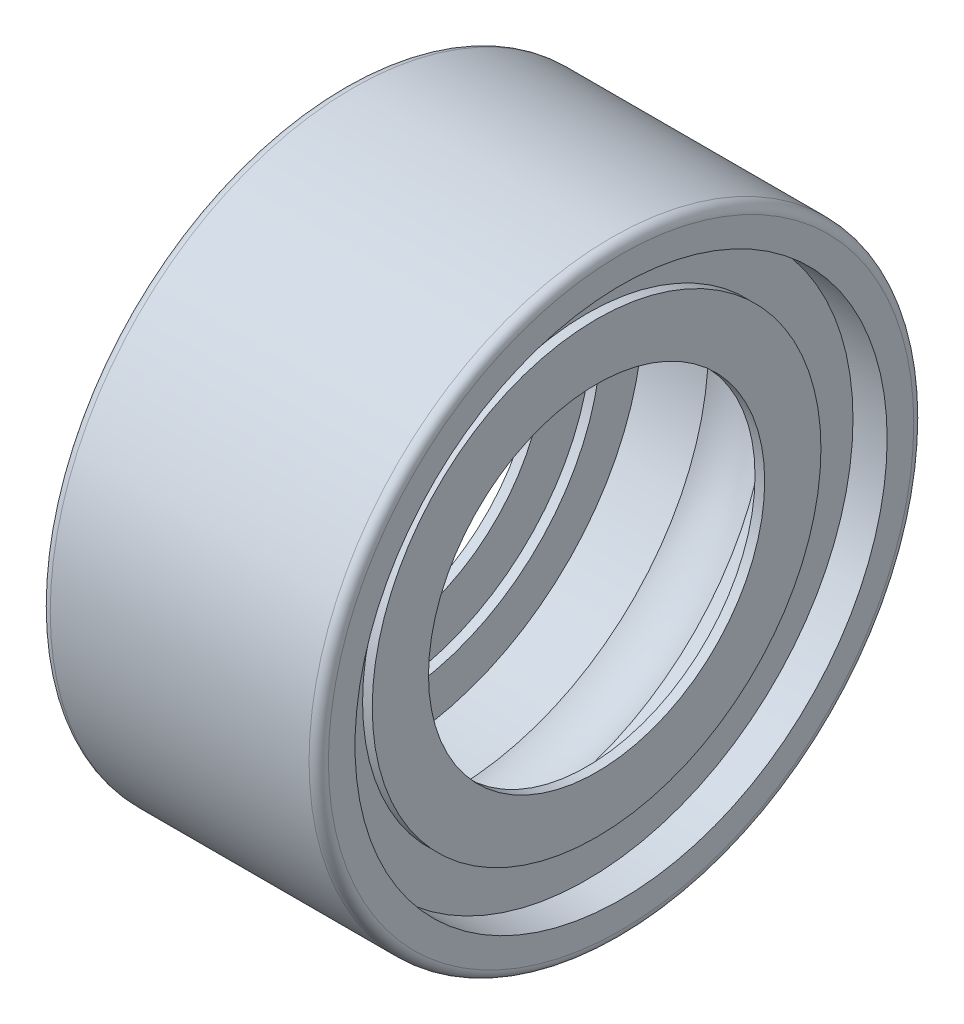
ISO-10303-21;
HEADER;
FILE_DESCRIPTION(('STEP AP214'),'2;1');
FILE_NAME('part.step','',(''),(''),'','','');
FILE_SCHEMA(('AUTOMOTIVE_DESIGN { 1 0 10303 214 1 1 1 1 }'));
ENDSEC;
DATA;
#1=APPLICATION_CONTEXT('core data for automotive mechanical design processes');
#2=APPLICATION_PROTOCOL_DEFINITION('international standard','automotive_design',2000,#1);
#3=PRODUCT_CONTEXT('',#1,'mechanical');
#4=PRODUCT('Part','Part','',(#3));
#5=PRODUCT_RELATED_PRODUCT_CATEGORY('part','',(#4));
#6=PRODUCT_DEFINITION_FORMATION('','',#4);
#7=PRODUCT_DEFINITION_CONTEXT('part definition',#1,'design');
#8=PRODUCT_DEFINITION('design','',#6,#7);
#9=PRODUCT_DEFINITION_SHAPE('','',#8);
#10=(LENGTH_UNIT() NAMED_UNIT(*) SI_UNIT(.MILLI.,.METRE.));
#11=(NAMED_UNIT(*) PLANE_ANGLE_UNIT() SI_UNIT($,.RADIAN.));
#12=(NAMED_UNIT(*) SI_UNIT($,.STERADIAN.) SOLID_ANGLE_UNIT());
#13=UNCERTAINTY_MEASURE_WITH_UNIT(LENGTH_MEASURE(1.E-05),#10,'distance_accuracy_value','');
#14=(GEOMETRIC_REPRESENTATION_CONTEXT(3) GLOBAL_UNCERTAINTY_ASSIGNED_CONTEXT((#13)) GLOBAL_UNIT_ASSIGNED_CONTEXT((#10,
#11,#12)) REPRESENTATION_CONTEXT('',''));
#15=CARTESIAN_POINT('',(0.,0.,0.));
#16=DIRECTION('',(0.,0.,1.));
#17=DIRECTION('',(1.,0.,0.));
#18=AXIS2_PLACEMENT_3D('',#15,#16,#17);
#19=CARTESIAN_POINT('',(-2.65,0.,0.));
#20=DIRECTION('',(1.,0.,0.));
#21=DIRECTION('',(0.,0.,1.));
#22=AXIS2_PLACEMENT_3D('',#19,#20,#21);
#23=TOROIDAL_SURFACE('',#22,1.775,0.425000000000002);
#24=CARTESIAN_POINT('',(-2.8981934729,0.,0.));
#25=DIRECTION('',(1.,0.,0.));
#26=DIRECTION('',(0.,0.,-1.));
#27=AXIS2_PLACEMENT_3D('',#24,#25,#26);
#28=CIRCLE('',#27,2.12);
#29=CARTESIAN_POINT('',(-2.8981934729,0.,-2.12));
#30=VERTEX_POINT('',#29);
#31=EDGE_CURVE('E466',#30,#30,#28,.F.);
#32=ORIENTED_EDGE('',*,*,#31,.T.);
#33=EDGE_LOOP('',(#32));
#34=FACE_BOUND('',#33,.T.);
#35=CARTESIAN_POINT('',(-2.40180652707996,0.,0.));
#36=DIRECTION('',(1.,0.,0.));
#37=DIRECTION('',(0.,0.,-1.));
#38=AXIS2_PLACEMENT_3D('',#35,#36,#37);
#39=CIRCLE('',#38,2.11999999999992);
#40=CARTESIAN_POINT('',(-2.40180652707996,0.,-2.11999999999992));
#41=VERTEX_POINT('',#40);
#42=EDGE_CURVE('E463',#41,#41,#39,.T.);
#43=ORIENTED_EDGE('',*,*,#42,.T.);
#44=EDGE_LOOP('',(#43));
#45=FACE_BOUND('',#44,.T.);
#46=ADVANCED_FACE('F17',(#34,#45),#23,.F.);
#47=CARTESIAN_POINT('',(-3.16784673645,0.,0.));
#48=DIRECTION('',(1.,0.,0.));
#49=DIRECTION('',(0.,0.,-1.));
#50=AXIS2_PLACEMENT_3D('',#47,#48,#49);
#51=CYLINDRICAL_SURFACE('',#50,2.12);
#52=CARTESIAN_POINT('',(-3.4375,0.,0.));
#53=DIRECTION('',(1.,0.,0.));
#54=DIRECTION('',(0.,0.,-1.));
#55=AXIS2_PLACEMENT_3D('',#52,#53,#54);
#56=CIRCLE('',#55,2.12);
#57=CARTESIAN_POINT('',(-3.4375,0.,-2.12));
#58=VERTEX_POINT('',#57);
#59=EDGE_CURVE('E461',#58,#58,#56,.T.);
#60=ORIENTED_EDGE('',*,*,#59,.F.);
#61=EDGE_LOOP('',(#60));
#62=FACE_BOUND('',#61,.T.);
#63=ORIENTED_EDGE('',*,*,#31,.F.);
#64=EDGE_LOOP('',(#63));
#65=FACE_BOUND('',#64,.T.);
#66=ADVANCED_FACE('F217',(#62,#65),#51,.F.);
#67=CARTESIAN_POINT('',(-2.13215326353998,0.,0.));
#68=DIRECTION('',(1.,0.,0.));
#69=DIRECTION('',(0.,0.,-1.));
#70=AXIS2_PLACEMENT_3D('',#67,#68,#69);
#71=CYLINDRICAL_SURFACE('',#70,2.11999999999992);
#72=ORIENTED_EDGE('',*,*,#42,.F.);
#73=EDGE_LOOP('',(#72));
#74=FACE_BOUND('',#73,.T.);
#75=CARTESIAN_POINT('',(-1.8625,0.,0.));
#76=DIRECTION('',(1.,0.,0.));
#77=DIRECTION('',(0.,0.,-1.));
#78=AXIS2_PLACEMENT_3D('',#75,#76,#77);
#79=CIRCLE('',#78,2.11999999999992);
#80=CARTESIAN_POINT('',(-1.8625,0.,-2.11999999999992));
#81=VERTEX_POINT('',#80);
#82=EDGE_CURVE('E459',#81,#81,#79,.F.);
#83=ORIENTED_EDGE('',*,*,#82,.F.);
#84=EDGE_LOOP('',(#83));
#85=FACE_BOUND('',#84,.T.);
#86=ADVANCED_FACE('F210',(#74,#85),#71,.F.);
#87=CARTESIAN_POINT('',(-3.4375,0.,1.9875));
#88=DIRECTION('',(1.,0.,0.));
#89=DIRECTION('',(0.,0.,-1.));
#90=AXIS2_PLACEMENT_3D('',#87,#88,#89);
#91=PLANE('',#90);
#92=ORIENTED_EDGE('',*,*,#59,.T.);
#93=EDGE_LOOP('',(#92));
#94=FACE_BOUND('',#93,.T.);
#95=CARTESIAN_POINT('',(-3.4375,0.,0.));
#96=DIRECTION('',(1.,0.,0.));
#97=DIRECTION('',(0.,0.,-1.));
#98=AXIS2_PLACEMENT_3D('',#95,#96,#97);
#99=CIRCLE('',#98,1.775);
#100=CARTESIAN_POINT('',(-3.4375,0.,-1.775));
#101=VERTEX_POINT('',#100);
#102=EDGE_CURVE('E456',#101,#101,#99,.F.);
#103=ORIENTED_EDGE('',*,*,#102,.T.);
#104=EDGE_LOOP('',(#103));
#105=FACE_BOUND('',#104,.T.);
#106=ADVANCED_FACE('F216',(#94,#105),#91,.T.);
#107=CARTESIAN_POINT('',(-1.8625,0.,1.9875));
#108=DIRECTION('',(-1.,0.,0.));
#109=DIRECTION('',(0.,0.,1.));
#110=AXIS2_PLACEMENT_3D('',#107,#108,#109);
#111=PLANE('',#110);
#112=ORIENTED_EDGE('',*,*,#82,.T.);
#113=EDGE_LOOP('',(#112));
#114=FACE_BOUND('',#113,.T.);
#115=CARTESIAN_POINT('',(-1.8625,0.,0.));
#116=DIRECTION('',(-1.,0.,0.));
#117=DIRECTION('',(0.,0.,1.));
#118=AXIS2_PLACEMENT_3D('',#115,#116,#117);
#119=CIRCLE('',#118,1.775);
#120=CARTESIAN_POINT('',(-1.8625,0.,1.775));
#121=VERTEX_POINT('',#120);
#122=EDGE_CURVE('E453',#121,#121,#119,.F.);
#123=ORIENTED_EDGE('',*,*,#122,.T.);
#124=EDGE_LOOP('',(#123));
#125=FACE_BOUND('',#124,.T.);
#126=ADVANCED_FACE('F273',(#114,#125),#111,.T.);
#127=CARTESIAN_POINT('',(-3.4775,0.,0.));
#128=DIRECTION('',(1.,0.,0.));
#129=DIRECTION('',(0.,0.,-1.));
#130=AXIS2_PLACEMENT_3D('',#127,#128,#129);
#131=CYLINDRICAL_SURFACE('',#130,1.775);
#132=CARTESIAN_POINT('',(-3.5175,0.,0.));
#133=DIRECTION('',(1.,0.,0.));
#134=DIRECTION('',(0.,0.,-1.));
#135=AXIS2_PLACEMENT_3D('',#132,#133,#134);
#136=CIRCLE('',#135,1.775);
#137=CARTESIAN_POINT('',(-3.5175,0.,-1.775));
#138=VERTEX_POINT('',#137);
#139=EDGE_CURVE('E450',#138,#138,#136,.T.);
#140=ORIENTED_EDGE('',*,*,#139,.F.);
#141=EDGE_LOOP('',(#140));
#142=FACE_BOUND('',#141,.T.);
#143=ORIENTED_EDGE('',*,*,#102,.F.);
#144=EDGE_LOOP('',(#143));
#145=FACE_BOUND('',#144,.T.);
#146=ADVANCED_FACE('F280',(#142,#145),#131,.F.);
#147=CARTESIAN_POINT('',(-1.8225,0.,0.));
#148=DIRECTION('',(-1.,0.,0.));
#149=DIRECTION('',(0.,0.,1.));
#150=AXIS2_PLACEMENT_3D('',#147,#148,#149);
#151=CYLINDRICAL_SURFACE('',#150,1.775);
#152=CARTESIAN_POINT('',(-1.7825,0.,0.));
#153=DIRECTION('',(-1.,0.,0.));
#154=DIRECTION('',(0.,0.,1.));
#155=AXIS2_PLACEMENT_3D('',#152,#153,#154);
#156=CIRCLE('',#155,1.775);
#157=CARTESIAN_POINT('',(-1.7825,0.,1.775));
#158=VERTEX_POINT('',#157);
#159=EDGE_CURVE('E447',#158,#158,#156,.T.);
#160=ORIENTED_EDGE('',*,*,#159,.F.);
#161=EDGE_LOOP('',(#160));
#162=FACE_BOUND('',#161,.T.);
#163=ORIENTED_EDGE('',*,*,#122,.F.);
#164=EDGE_LOOP('',(#163));
#165=FACE_BOUND('',#164,.T.);
#166=ADVANCED_FACE('F288',(#162,#165),#151,.F.);
#167=CARTESIAN_POINT('',(-3.5175,0.,1.5825));
#168=DIRECTION('',(1.,0.,0.));
#169=DIRECTION('',(0.,0.,-1.));
#170=AXIS2_PLACEMENT_3D('',#167,#168,#169);
#171=PLANE('',#170);
#172=ORIENTED_EDGE('',*,*,#139,.T.);
#173=EDGE_LOOP('',(#172));
#174=FACE_BOUND('',#173,.T.);
#175=CARTESIAN_POINT('',(-3.5175,0.,0.));
#176=DIRECTION('',(1.,0.,0.));
#177=DIRECTION('',(0.,0.,-1.));
#178=AXIS2_PLACEMENT_3D('',#175,#176,#177);
#179=CIRCLE('',#178,1.39);
#180=CARTESIAN_POINT('',(-3.5175,0.,-1.39));
#181=VERTEX_POINT('',#180);
#182=EDGE_CURVE('E444',#181,#181,#179,.F.);
#183=ORIENTED_EDGE('',*,*,#182,.T.);
#184=EDGE_LOOP('',(#183));
#185=FACE_BOUND('',#184,.T.);
#186=ADVANCED_FACE('F296',(#174,#185),#171,.T.);
#187=CARTESIAN_POINT('',(-1.7825,0.,1.5825));
#188=DIRECTION('',(-1.,0.,0.));
#189=DIRECTION('',(0.,0.,1.));
#190=AXIS2_PLACEMENT_3D('',#187,#188,#189);
#191=PLANE('',#190);
#192=ORIENTED_EDGE('',*,*,#159,.T.);
#193=EDGE_LOOP('',(#192));
#194=FACE_BOUND('',#193,.T.);
#195=CARTESIAN_POINT('',(-1.7825,0.,0.));
#196=DIRECTION('',(-1.,0.,0.));
#197=DIRECTION('',(0.,0.,1.));
#198=AXIS2_PLACEMENT_3D('',#195,#196,#197);
#199=CIRCLE('',#198,1.39);
#200=CARTESIAN_POINT('',(-1.7825,0.,1.39));
#201=VERTEX_POINT('',#200);
#202=EDGE_CURVE('E441',#201,#201,#199,.F.);
#203=ORIENTED_EDGE('',*,*,#202,.T.);
#204=EDGE_LOOP('',(#203));
#205=FACE_BOUND('',#204,.T.);
#206=ADVANCED_FACE('F304',(#194,#205),#191,.T.);
#207=CARTESIAN_POINT('',(-3.5575,0.,0.));
#208=DIRECTION('',(1.,0.,0.));
#209=DIRECTION('',(0.,0.,-1.));
#210=AXIS2_PLACEMENT_3D('',#207,#208,#209);
#211=CYLINDRICAL_SURFACE('',#210,1.39);
#212=CARTESIAN_POINT('',(-3.5975,0.,0.));
#213=DIRECTION('',(1.,0.,0.));
#214=DIRECTION('',(0.,0.,-1.));
#215=AXIS2_PLACEMENT_3D('',#212,#213,#214);
#216=CIRCLE('',#215,1.39);
#217=CARTESIAN_POINT('',(-3.5975,0.,-1.39));
#218=VERTEX_POINT('',#217);
#219=EDGE_CURVE('E438',#218,#218,#216,.T.);
#220=ORIENTED_EDGE('',*,*,#219,.F.);
#221=EDGE_LOOP('',(#220));
#222=FACE_BOUND('',#221,.T.);
#223=ORIENTED_EDGE('',*,*,#182,.F.);
#224=EDGE_LOOP('',(#223));
#225=FACE_BOUND('',#224,.T.);
#226=ADVANCED_FACE('F312',(#222,#225),#211,.F.);
#227=CARTESIAN_POINT('',(-1.7425,0.,0.));
#228=DIRECTION('',(-1.,0.,0.));
#229=DIRECTION('',(0.,0.,1.));
#230=AXIS2_PLACEMENT_3D('',#227,#228,#229);
#231=CYLINDRICAL_SURFACE('',#230,1.39);
#232=CARTESIAN_POINT('',(-1.7025,0.,0.));
#233=DIRECTION('',(-1.,0.,0.));
#234=DIRECTION('',(0.,0.,1.));
#235=AXIS2_PLACEMENT_3D('',#232,#233,#234);
#236=CIRCLE('',#235,1.39);
#237=CARTESIAN_POINT('',(-1.7025,0.,1.39));
#238=VERTEX_POINT('',#237);
#239=EDGE_CURVE('E435',#238,#238,#236,.T.);
#240=ORIENTED_EDGE('',*,*,#239,.F.);
#241=EDGE_LOOP('',(#240));
#242=FACE_BOUND('',#241,.T.);
#243=ORIENTED_EDGE('',*,*,#202,.F.);
#244=EDGE_LOOP('',(#243));
#245=FACE_BOUND('',#244,.T.);
#246=ADVANCED_FACE('F320',(#242,#245),#231,.F.);
#247=CARTESIAN_POINT('',(-3.5975,0.,1.6225));
#248=DIRECTION('',(-1.,0.,0.));
#249=DIRECTION('',(0.,0.,1.));
#250=AXIS2_PLACEMENT_3D('',#247,#248,#249);
#251=PLANE('',#250);
#252=ORIENTED_EDGE('',*,*,#219,.T.);
#253=EDGE_LOOP('',(#252));
#254=FACE_BOUND('',#253,.T.);
#255=CARTESIAN_POINT('',(-3.5975,0.,0.));
#256=DIRECTION('',(1.,0.,0.));
#257=DIRECTION('',(0.,0.,-1.));
#258=AXIS2_PLACEMENT_3D('',#255,#256,#257);
#259=CIRCLE('',#258,1.855);
#260=CARTESIAN_POINT('',(-3.5975,0.,-1.855));
#261=VERTEX_POINT('',#260);
#262=EDGE_CURVE('E432',#261,#261,#259,.T.);
#263=ORIENTED_EDGE('',*,*,#262,.F.);
#264=EDGE_LOOP('',(#263));
#265=FACE_BOUND('',#264,.T.);
#266=ADVANCED_FACE('F328',(#254,#265),#251,.T.);
#267=CARTESIAN_POINT('',(-1.7025,0.,1.6225));
#268=DIRECTION('',(1.,0.,0.));
#269=DIRECTION('',(0.,0.,-1.));
#270=AXIS2_PLACEMENT_3D('',#267,#268,#269);
#271=PLANE('',#270);
#272=ORIENTED_EDGE('',*,*,#239,.T.);
#273=EDGE_LOOP('',(#272));
#274=FACE_BOUND('',#273,.T.);
#275=CARTESIAN_POINT('',(-1.7025,0.,0.));
#276=DIRECTION('',(-1.,0.,0.));
#277=DIRECTION('',(0.,0.,1.));
#278=AXIS2_PLACEMENT_3D('',#275,#276,#277);
#279=CIRCLE('',#278,1.855);
#280=CARTESIAN_POINT('',(-1.7025,0.,1.855));
#281=VERTEX_POINT('',#280);
#282=EDGE_CURVE('E429',#281,#281,#279,.T.);
#283=ORIENTED_EDGE('',*,*,#282,.F.);
#284=EDGE_LOOP('',(#283));
#285=FACE_BOUND('',#284,.T.);
#286=ADVANCED_FACE('F336',(#274,#285),#271,.T.);
#287=CARTESIAN_POINT('',(-3.5575,0.,0.));
#288=DIRECTION('',(1.,0.,0.));
#289=DIRECTION('',(0.,0.,-1.));
#290=AXIS2_PLACEMENT_3D('',#287,#288,#289);
#291=CYLINDRICAL_SURFACE('',#290,1.855);
#292=CARTESIAN_POINT('',(-3.5175,0.,0.));
#293=DIRECTION('',(1.,0.,0.));
#294=DIRECTION('',(0.,0.,-1.));
#295=AXIS2_PLACEMENT_3D('',#292,#293,#294);
#296=CIRCLE('',#295,1.855);
#297=CARTESIAN_POINT('',(-3.5175,0.,-1.855));
#298=VERTEX_POINT('',#297);
#299=EDGE_CURVE('E426',#298,#298,#296,.T.);
#300=ORIENTED_EDGE('',*,*,#299,.F.);
#301=EDGE_LOOP('',(#300));
#302=FACE_BOUND('',#301,.T.);
#303=ORIENTED_EDGE('',*,*,#262,.T.);
#304=EDGE_LOOP('',(#303));
#305=FACE_BOUND('',#304,.T.);
#306=ADVANCED_FACE('F344',(#302,#305),#291,.T.);
#307=CARTESIAN_POINT('',(-1.7425,0.,0.));
#308=DIRECTION('',(-1.,0.,0.));
#309=DIRECTION('',(0.,0.,1.));
#310=AXIS2_PLACEMENT_3D('',#307,#308,#309);
#311=CYLINDRICAL_SURFACE('',#310,1.855);
#312=CARTESIAN_POINT('',(-1.7825,0.,0.));
#313=DIRECTION('',(-1.,0.,0.));
#314=DIRECTION('',(0.,0.,1.));
#315=AXIS2_PLACEMENT_3D('',#312,#313,#314);
#316=CIRCLE('',#315,1.855);
#317=CARTESIAN_POINT('',(-1.7825,0.,1.855));
#318=VERTEX_POINT('',#317);
#319=EDGE_CURVE('E413',#318,#318,#316,.T.);
#320=ORIENTED_EDGE('',*,*,#319,.F.);
#321=EDGE_LOOP('',(#320));
#322=FACE_BOUND('',#321,.T.);
#323=ORIENTED_EDGE('',*,*,#282,.T.);
#324=EDGE_LOOP('',(#323));
#325=FACE_BOUND('',#324,.T.);
#326=ADVANCED_FACE('F352',(#322,#325),#311,.T.);
#327=CARTESIAN_POINT('',(-3.5175,0.,2.0275));
#328=DIRECTION('',(-1.,0.,0.));
#329=DIRECTION('',(0.,0.,1.));
#330=AXIS2_PLACEMENT_3D('',#327,#328,#329);
#331=PLANE('',#330);
#332=ORIENTED_EDGE('',*,*,#299,.T.);
#333=EDGE_LOOP('',(#332));
#334=FACE_BOUND('',#333,.T.);
#335=CARTESIAN_POINT('',(-3.5175,0.,0.));
#336=DIRECTION('',(1.,0.,0.));
#337=DIRECTION('',(0.,0.,-1.));
#338=AXIS2_PLACEMENT_3D('',#335,#336,#337);
#339=CIRCLE('',#338,2.2);
#340=CARTESIAN_POINT('',(-3.5175,0.,-2.2));
#341=VERTEX_POINT('',#340);
#342=EDGE_CURVE('E417',#341,#341,#339,.F.);
#343=ORIENTED_EDGE('',*,*,#342,.T.);
#344=EDGE_LOOP('',(#343));
#345=FACE_BOUND('',#344,.T.);
#346=ADVANCED_FACE('F360',(#334,#345),#331,.T.);
#347=CARTESIAN_POINT('',(-1.7825,0.,2.0275));
#348=DIRECTION('',(1.,0.,0.));
#349=DIRECTION('',(0.,0.,-1.));
#350=AXIS2_PLACEMENT_3D('',#347,#348,#349);
#351=PLANE('',#350);
#352=ORIENTED_EDGE('',*,*,#319,.T.);
#353=EDGE_LOOP('',(#352));
#354=FACE_BOUND('',#353,.T.);
#355=CARTESIAN_POINT('',(-1.7825,0.,0.));
#356=DIRECTION('',(1.,0.,0.));
#357=DIRECTION('',(0.,0.,-1.));
#358=AXIS2_PLACEMENT_3D('',#355,#356,#357);
#359=CIRCLE('',#358,2.2);
#360=CARTESIAN_POINT('',(-1.7825,0.,-2.2));
#361=VERTEX_POINT('',#360);
#362=EDGE_CURVE('E416',#361,#361,#359,.T.);
#363=ORIENTED_EDGE('',*,*,#362,.T.);
#364=EDGE_LOOP('',(#363));
#365=FACE_BOUND('',#364,.T.);
#366=ADVANCED_FACE('F203',(#354,#365),#351,.T.);
#367=CARTESIAN_POINT('',(-3.61875,0.,0.));
#368=DIRECTION('',(1.,0.,0.));
#369=DIRECTION('',(0.,0.,-1.));
#370=AXIS2_PLACEMENT_3D('',#367,#368,#369);
#371=CYLINDRICAL_SURFACE('',#370,2.2);
#372=CARTESIAN_POINT('',(-3.8,0.,0.));
#373=DIRECTION('',(1.,0.,0.));
#374=DIRECTION('',(0.,0.,-1.));
#375=AXIS2_PLACEMENT_3D('',#372,#373,#374);
#376=CIRCLE('',#375,2.2);
#377=CARTESIAN_POINT('',(-3.8,0.,-2.2));
#378=VERTEX_POINT('',#377);
#379=EDGE_CURVE('E55',#378,#378,#376,.T.);
#380=ORIENTED_EDGE('',*,*,#379,.F.);
#381=EDGE_LOOP('',(#380));
#382=FACE_BOUND('',#381,.T.);
#383=ORIENTED_EDGE('',*,*,#342,.F.);
#384=EDGE_LOOP('',(#383));
#385=FACE_BOUND('',#384,.T.);
#386=ADVANCED_FACE('F193',(#382,#385),#371,.F.);
#387=CARTESIAN_POINT('',(-1.68125,0.,0.));
#388=DIRECTION('',(1.,0.,0.));
#389=DIRECTION('',(0.,0.,-1.));
#390=AXIS2_PLACEMENT_3D('',#387,#388,#389);
#391=CYLINDRICAL_SURFACE('',#390,2.2);
#392=ORIENTED_EDGE('',*,*,#362,.F.);
#393=EDGE_LOOP('',(#392));
#394=FACE_BOUND('',#393,.T.);
#395=CARTESIAN_POINT('',(-1.5,0.,0.));
#396=DIRECTION('',(1.,0.,0.));
#397=DIRECTION('',(0.,0.,-1.));
#398=AXIS2_PLACEMENT_3D('',#395,#396,#397);
#399=CIRCLE('',#398,2.2);
#400=CARTESIAN_POINT('',(-1.5,0.,-2.2));
#401=VERTEX_POINT('',#400);
#402=EDGE_CURVE('E54',#401,#401,#399,.F.);
#403=ORIENTED_EDGE('',*,*,#402,.F.);
#404=EDGE_LOOP('',(#403));
#405=FACE_BOUND('',#404,.T.);
#406=ADVANCED_FACE('F80',(#394,#405),#391,.F.);
#407=CARTESIAN_POINT('',(-3.8,0.,-2.31));
#408=DIRECTION('',(-1.,0.,0.));
#409=DIRECTION('',(0.,0.,1.));
#410=AXIS2_PLACEMENT_3D('',#407,#408,#409);
#411=PLANE('',#410);
#412=ORIENTED_EDGE('',*,*,#379,.T.);
#413=EDGE_LOOP('',(#412));
#414=FACE_BOUND('',#413,.T.);
#415=CARTESIAN_POINT('',(-3.8,0.,0.));
#416=DIRECTION('',(1.,0.,0.));
#417=DIRECTION('',(0.,0.,-1.));
#418=AXIS2_PLACEMENT_3D('',#415,#416,#417);
#419=CIRCLE('',#418,2.42);
#420=CARTESIAN_POINT('',(-3.8,0.,-2.42));
#421=VERTEX_POINT('',#420);
#422=CARTESIAN_POINT('',(-3.8,0.,2.42));
#423=VERTEX_POINT('',#422);
#424=EDGE_CURVE('E50',#421,#423,#419,.T.);
#425=ORIENTED_EDGE('',*,*,#424,.F.);
#426=CARTESIAN_POINT('',(-3.8,0.,0.));
#427=DIRECTION('',(1.,0.,0.));
#428=DIRECTION('',(0.,0.,1.));
#429=AXIS2_PLACEMENT_3D('',#426,#427,#428);
#430=CIRCLE('',#429,2.42);
#431=EDGE_CURVE('E46',#423,#421,#430,.T.);
#432=ORIENTED_EDGE('',*,*,#431,.F.);
#433=EDGE_LOOP('',(#425,#432));
#434=FACE_BOUND('',#433,.T.);
#435=ADVANCED_FACE('F59',(#414,#434),#411,.T.);
#436=CARTESIAN_POINT('',(-1.5,0.,-2.31));
#437=DIRECTION('',(1.,0.,0.));
#438=DIRECTION('',(0.,0.,-1.));
#439=AXIS2_PLACEMENT_3D('',#436,#437,#438);
#440=PLANE('',#439);
#441=CARTESIAN_POINT('',(-1.5,0.,0.));
#442=DIRECTION('',(-1.,0.,0.));
#443=DIRECTION('',(0.,0.,1.));
#444=AXIS2_PLACEMENT_3D('',#441,#442,#443);
#445=CIRCLE('',#444,2.42);
#446=CARTESIAN_POINT('',(-1.5,0.,2.42));
#447=VERTEX_POINT('',#446);
#448=CARTESIAN_POINT('',(-1.5,0.,-2.42));
#449=VERTEX_POINT('',#448);
#450=EDGE_CURVE('E60',#447,#449,#445,.T.);
#451=ORIENTED_EDGE('',*,*,#450,.F.);
#452=CARTESIAN_POINT('',(-1.5,0.,0.));
#453=DIRECTION('',(-1.,0.,0.));
#454=DIRECTION('',(0.,0.,-1.));
#455=AXIS2_PLACEMENT_3D('',#452,#453,#454);
#456=CIRCLE('',#455,2.42);
#457=EDGE_CURVE('E35',#447,#449,#456,.F.);
#458=ORIENTED_EDGE('',*,*,#457,.T.);
#459=EDGE_LOOP('',(#451,#458));
#460=FACE_BOUND('',#459,.T.);
#461=ORIENTED_EDGE('',*,*,#402,.T.);
#462=EDGE_LOOP('',(#461));
#463=FACE_BOUND('',#462,.T.);
#464=ADVANCED_FACE('F79',(#460,#463),#440,.T.);
#465=CARTESIAN_POINT('',(-3.72,0.,0.));
#466=DIRECTION('',(1.,0.,0.));
#467=DIRECTION('',(0.,0.,1.));
#468=AXIS2_PLACEMENT_3D('',#465,#466,#467);
#469=TOROIDAL_SURFACE('',#468,2.42,0.0799999999999996);
#470=CARTESIAN_POINT('',(-3.72,0.,0.));
#471=DIRECTION('',(1.,0.,0.));
#472=DIRECTION('',(0.,0.,-1.));
#473=AXIS2_PLACEMENT_3D('',#470,#471,#472);
#474=CIRCLE('',#473,2.5);
#475=CARTESIAN_POINT('',(-3.72,0.,-2.5));
#476=VERTEX_POINT('',#475);
#477=EDGE_CURVE('E29',#476,#476,#474,.T.);
#478=ORIENTED_EDGE('',*,*,#477,.F.);
#479=EDGE_LOOP('',(#478));
#480=FACE_BOUND('',#479,.T.);
#481=ORIENTED_EDGE('',*,*,#424,.T.);
#482=ORIENTED_EDGE('',*,*,#431,.T.);
#483=EDGE_LOOP('',(#481,#482));
#484=FACE_BOUND('',#483,.T.);
#485=ADVANCED_FACE('F49',(#480,#484),#469,.T.);
#486=CARTESIAN_POINT('',(-1.58,0.,0.));
#487=DIRECTION('',(1.,0.,0.));
#488=DIRECTION('',(0.,0.,1.));
#489=AXIS2_PLACEMENT_3D('',#486,#487,#488);
#490=TOROIDAL_SURFACE('',#489,2.42,0.0799999999999996);
#491=CARTESIAN_POINT('',(-1.58,0.,0.));
#492=DIRECTION('',(1.,0.,0.));
#493=DIRECTION('',(0.,0.,-1.));
#494=AXIS2_PLACEMENT_3D('',#491,#492,#493);
#495=CIRCLE('',#494,2.5);
#496=CARTESIAN_POINT('',(-1.58,0.,-2.5));
#497=VERTEX_POINT('',#496);
#498=EDGE_CURVE('E11',#497,#497,#495,.F.);
#499=ORIENTED_EDGE('',*,*,#498,.F.);
#500=EDGE_LOOP('',(#499));
#501=FACE_BOUND('',#500,.T.);
#502=ORIENTED_EDGE('',*,*,#450,.T.);
#503=ORIENTED_EDGE('',*,*,#457,.F.);
#504=EDGE_LOOP('',(#502,#503));
#505=FACE_BOUND('',#504,.T.);
#506=ADVANCED_FACE('F105',(#501,#505),#490,.T.);
#507=CARTESIAN_POINT('',(-2.65,0.,0.));
#508=DIRECTION('',(1.,0.,0.));
#509=DIRECTION('',(0.,0.,-1.));
#510=AXIS2_PLACEMENT_3D('',#507,#508,#509);
#511=CYLINDRICAL_SURFACE('',#510,2.5);
#512=ORIENTED_EDGE('',*,*,#477,.T.);
#513=EDGE_LOOP('',(#512));
#514=FACE_BOUND('',#513,.T.);
#515=ORIENTED_EDGE('',*,*,#498,.T.);
#516=EDGE_LOOP('',(#515));
#517=FACE_BOUND('',#516,.T.);
#518=ADVANCED_FACE('F134',(#514,#517),#511,.T.);
#519=CLOSED_SHELL('',(#46,#66,#86,#106,#126,#146,#166,#186,#206,#226,#246,#266,#286,#306,#326,
#346,#366,#386,#406,#435,#464,#485,#506,#518));
#520=MANIFOLD_SOLID_BREP('B1',#519);
#521=ADVANCED_BREP_SHAPE_REPRESENTATION('',(#18,#520),#14);
#522=SHAPE_DEFINITION_REPRESENTATION(#9,#521);
ENDSEC;
END-ISO-10303-21;
